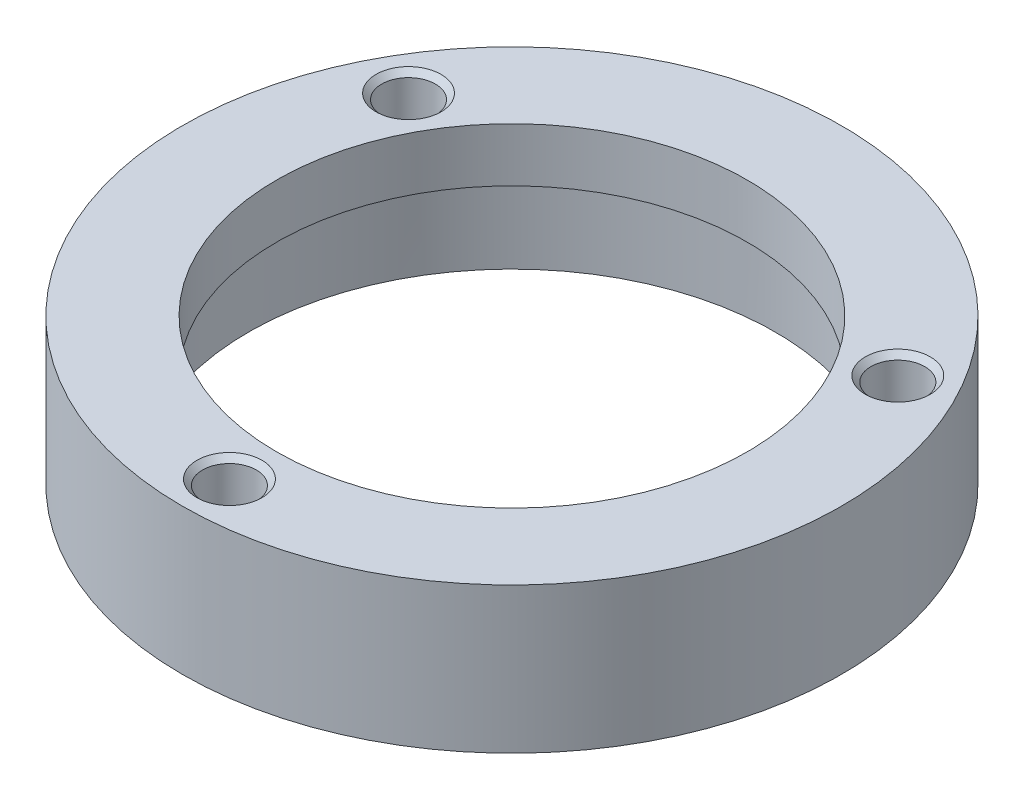
ISO-10303-21;
HEADER;
FILE_DESCRIPTION(('STEP AP214'),'2;1');
FILE_NAME('part.step','',(''),(''),'','','');
FILE_SCHEMA(('AUTOMOTIVE_DESIGN { 1 0 10303 214 1 1 1 1 }'));
ENDSEC;
DATA;
#1=APPLICATION_CONTEXT('core data for automotive mechanical design processes');
#2=APPLICATION_PROTOCOL_DEFINITION('international standard','automotive_design',2000,#1);
#3=PRODUCT_CONTEXT('',#1,'mechanical');
#4=PRODUCT('Part','Part','',(#3));
#5=PRODUCT_RELATED_PRODUCT_CATEGORY('part','',(#4));
#6=PRODUCT_DEFINITION_FORMATION('','',#4);
#7=PRODUCT_DEFINITION_CONTEXT('part definition',#1,'design');
#8=PRODUCT_DEFINITION('design','',#6,#7);
#9=PRODUCT_DEFINITION_SHAPE('','',#8);
#10=(LENGTH_UNIT() NAMED_UNIT(*) SI_UNIT(.MILLI.,.METRE.));
#11=(NAMED_UNIT(*) PLANE_ANGLE_UNIT() SI_UNIT($,.RADIAN.));
#12=(NAMED_UNIT(*) SI_UNIT($,.STERADIAN.) SOLID_ANGLE_UNIT());
#13=UNCERTAINTY_MEASURE_WITH_UNIT(LENGTH_MEASURE(1.E-05),#10,'distance_accuracy_value','');
#14=(GEOMETRIC_REPRESENTATION_CONTEXT(3) GLOBAL_UNCERTAINTY_ASSIGNED_CONTEXT((#13)) GLOBAL_UNIT_ASSIGNED_CONTEXT((#10,
#11,#12)) REPRESENTATION_CONTEXT('',''));
#15=CARTESIAN_POINT('',(0.,0.,0.));
#16=DIRECTION('',(0.,0.,1.));
#17=DIRECTION('',(1.,0.,0.));
#18=AXIS2_PLACEMENT_3D('',#15,#16,#17);
#19=CARTESIAN_POINT('',(0.,13.,0.));
#20=DIRECTION('',(0.,1.,0.));
#21=DIRECTION('',(0.,0.,-1.));
#22=AXIS2_PLACEMENT_3D('',#19,#20,#21);
#23=PLANE('',#22);
#24=CARTESIAN_POINT('',(-21.8238401753679,13.,-12.6));
#25=DIRECTION('',(0.,-1.,0.));
#26=DIRECTION('',(0.,0.,-1.));
#27=AXIS2_PLACEMENT_3D('',#24,#25,#26);
#28=CIRCLE('',#27,2.90000000000001);
#29=CARTESIAN_POINT('',(-21.8238401753679,13.,-15.5));
#30=VERTEX_POINT('',#29);
#31=EDGE_CURVE('E55',#30,#30,#28,.F.);
#32=ORIENTED_EDGE('',*,*,#31,.F.);
#33=EDGE_LOOP('',(#32));
#34=FACE_BOUND('',#33,.T.);
#35=CARTESIAN_POINT('',(21.8238401753679,13.,-12.6));
#36=DIRECTION('',(0.,-1.,0.));
#37=DIRECTION('',(0.,0.,-1.));
#38=AXIS2_PLACEMENT_3D('',#35,#36,#37);
#39=CIRCLE('',#38,2.90000000000012);
#40=CARTESIAN_POINT('',(21.8238401753679,13.,-15.5000000000001));
#41=VERTEX_POINT('',#40);
#42=EDGE_CURVE('E60',#41,#41,#39,.F.);
#43=ORIENTED_EDGE('',*,*,#42,.F.);
#44=EDGE_LOOP('',(#43));
#45=FACE_BOUND('',#44,.T.);
#46=CARTESIAN_POINT('',(0.,13.,25.2));
#47=DIRECTION('',(0.,-1.,0.));
#48=DIRECTION('',(0.,0.,-1.));
#49=AXIS2_PLACEMENT_3D('',#46,#47,#48);
#50=CIRCLE('',#49,2.90000000000001);
#51=CARTESIAN_POINT('',(0.,13.,22.3));
#52=VERTEX_POINT('',#51);
#53=EDGE_CURVE('E63',#52,#52,#50,.F.);
#54=ORIENTED_EDGE('',*,*,#53,.F.);
#55=EDGE_LOOP('',(#54));
#56=FACE_BOUND('',#55,.T.);
#57=CARTESIAN_POINT('',(0.,13.,0.));
#58=DIRECTION('',(0.,-1.,0.));
#59=DIRECTION('',(0.,0.,-1.));
#60=AXIS2_PLACEMENT_3D('',#57,#58,#59);
#61=CIRCLE('',#60,29.4);
#62=CARTESIAN_POINT('',(0.,13.,29.4));
#63=VERTEX_POINT('',#62);
#64=EDGE_CURVE('E69',#63,#63,#61,.T.);
#65=ORIENTED_EDGE('',*,*,#64,.F.);
#66=EDGE_LOOP('',(#65));
#67=FACE_BOUND('',#66,.T.);
#68=CARTESIAN_POINT('',(0.,13.,0.));
#69=DIRECTION('',(0.,-1.,0.));
#70=DIRECTION('',(0.,0.,-1.));
#71=AXIS2_PLACEMENT_3D('',#68,#69,#70);
#72=CIRCLE('',#71,21.);
#73=CARTESIAN_POINT('',(0.,13.,21.));
#74=VERTEX_POINT('',#73);
#75=EDGE_CURVE('E73',#74,#74,#72,.T.);
#76=ORIENTED_EDGE('',*,*,#75,.T.);
#77=EDGE_LOOP('',(#76));
#78=FACE_BOUND('',#77,.T.);
#79=ADVANCED_FACE('F43',(#34,#45,#56,#67,#78),#23,.T.);
#80=CARTESIAN_POINT('',(0.,0.,0.));
#81=DIRECTION('',(0.,1.,0.));
#82=DIRECTION('',(0.,0.,-1.));
#83=AXIS2_PLACEMENT_3D('',#80,#81,#82);
#84=PLANE('',#83);
#85=CARTESIAN_POINT('',(0.,0.,0.));
#86=DIRECTION('',(0.,1.,0.));
#87=DIRECTION('',(0.,0.,1.));
#88=AXIS2_PLACEMENT_3D('',#85,#86,#87);
#89=CIRCLE('',#88,23.5);
#90=CARTESIAN_POINT('',(0.,0.,23.5));
#91=VERTEX_POINT('',#90);
#92=EDGE_CURVE('E90',#91,#91,#89,.T.);
#93=ORIENTED_EDGE('',*,*,#92,.T.);
#94=EDGE_LOOP('',(#93));
#95=FACE_BOUND('',#94,.T.);
#96=CARTESIAN_POINT('',(0.,0.,0.));
#97=DIRECTION('',(0.,-1.,0.));
#98=DIRECTION('',(0.,0.,-1.));
#99=AXIS2_PLACEMENT_3D('',#96,#97,#98);
#100=CIRCLE('',#99,29.4);
#101=CARTESIAN_POINT('',(0.,0.,29.4));
#102=VERTEX_POINT('',#101);
#103=EDGE_CURVE('E70',#102,#102,#100,.T.);
#104=ORIENTED_EDGE('',*,*,#103,.T.);
#105=EDGE_LOOP('',(#104));
#106=FACE_BOUND('',#105,.T.);
#107=ADVANCED_FACE('F94',(#95,#106),#84,.F.);
#108=CARTESIAN_POINT('',(0.,13.,0.));
#109=DIRECTION('',(0.,-1.,0.));
#110=DIRECTION('',(0.,0.,1.));
#111=AXIS2_PLACEMENT_3D('',#108,#109,#110);
#112=CYLINDRICAL_SURFACE('',#111,29.4);
#113=CARTESIAN_POINT('',(0.,13.,29.4));
#114=CARTESIAN_POINT('',(0.,12.8645833333333,29.4));
#115=CARTESIAN_POINT('',(0.,12.7291666666667,29.4));
#116=CARTESIAN_POINT('',(0.,12.4583333333333,29.4));
#117=CARTESIAN_POINT('',(0.,12.3229166666667,29.4));
#118=CARTESIAN_POINT('',(0.,12.0520833333333,29.4));
#119=CARTESIAN_POINT('',(0.,11.9166666666667,29.4));
#120=CARTESIAN_POINT('',(0.,11.6458333333333,29.4));
#121=CARTESIAN_POINT('',(0.,11.5104166666667,29.4));
#122=CARTESIAN_POINT('',(0.,11.2395833333333,29.4));
#123=CARTESIAN_POINT('',(0.,11.1041666666667,29.4));
#124=CARTESIAN_POINT('',(0.,10.8333333333333,29.4));
#125=CARTESIAN_POINT('',(0.,10.6979166666667,29.4));
#126=CARTESIAN_POINT('',(0.,10.4270833333333,29.4));
#127=CARTESIAN_POINT('',(0.,10.2916666666667,29.4));
#128=CARTESIAN_POINT('',(0.,10.0208333333333,29.4));
#129=CARTESIAN_POINT('',(0.,9.88541666666667,29.4));
#130=CARTESIAN_POINT('',(0.,9.61458333333333,29.4));
#131=CARTESIAN_POINT('',(0.,9.47916666666667,29.4));
#132=CARTESIAN_POINT('',(0.,9.20833333333333,29.4));
#133=CARTESIAN_POINT('',(0.,9.07291666666667,29.4));
#134=CARTESIAN_POINT('',(0.,8.80208333333333,29.4));
#135=CARTESIAN_POINT('',(0.,8.66666666666667,29.4));
#136=CARTESIAN_POINT('',(0.,8.39583333333333,29.4));
#137=CARTESIAN_POINT('',(0.,8.26041666666667,29.4));
#138=CARTESIAN_POINT('',(0.,7.98958333333333,29.4));
#139=CARTESIAN_POINT('',(0.,7.85416666666667,29.4));
#140=CARTESIAN_POINT('',(0.,7.58333333333333,29.4));
#141=CARTESIAN_POINT('',(0.,7.44791666666667,29.4));
#142=CARTESIAN_POINT('',(0.,7.17708333333333,29.4));
#143=CARTESIAN_POINT('',(0.,7.04166666666667,29.4));
#144=CARTESIAN_POINT('',(0.,6.77083333333333,29.4));
#145=CARTESIAN_POINT('',(0.,6.63541666666667,29.4));
#146=CARTESIAN_POINT('',(0.,6.36458333333333,29.4));
#147=CARTESIAN_POINT('',(0.,6.22916666666667,29.4));
#148=CARTESIAN_POINT('',(0.,5.95833333333333,29.4));
#149=CARTESIAN_POINT('',(0.,5.82291666666667,29.4));
#150=CARTESIAN_POINT('',(0.,5.55208333333333,29.4));
#151=CARTESIAN_POINT('',(0.,5.41666666666667,29.4));
#152=CARTESIAN_POINT('',(0.,5.14583333333333,29.4));
#153=CARTESIAN_POINT('',(0.,5.01041666666667,29.4));
#154=CARTESIAN_POINT('',(0.,4.73958333333333,29.4));
#155=CARTESIAN_POINT('',(0.,4.60416666666667,29.4));
#156=CARTESIAN_POINT('',(0.,4.33333333333333,29.4));
#157=CARTESIAN_POINT('',(0.,4.19791666666667,29.4));
#158=CARTESIAN_POINT('',(0.,3.92708333333333,29.4));
#159=CARTESIAN_POINT('',(0.,3.79166666666667,29.4));
#160=CARTESIAN_POINT('',(0.,3.52083333333333,29.4));
#161=CARTESIAN_POINT('',(0.,3.38541666666667,29.4));
#162=CARTESIAN_POINT('',(0.,3.11458333333333,29.4));
#163=CARTESIAN_POINT('',(0.,2.97916666666667,29.4));
#164=CARTESIAN_POINT('',(0.,2.70833333333333,29.4));
#165=CARTESIAN_POINT('',(0.,2.57291666666667,29.4));
#166=CARTESIAN_POINT('',(0.,2.30208333333333,29.4));
#167=CARTESIAN_POINT('',(0.,2.16666666666667,29.4));
#168=CARTESIAN_POINT('',(0.,1.89583333333333,29.4));
#169=CARTESIAN_POINT('',(0.,1.76041666666667,29.4));
#170=CARTESIAN_POINT('',(0.,1.48958333333333,29.4));
#171=CARTESIAN_POINT('',(0.,1.35416666666667,29.4));
#172=CARTESIAN_POINT('',(0.,1.08333333333333,29.4));
#173=CARTESIAN_POINT('',(0.,0.947916666666667,29.4));
#174=CARTESIAN_POINT('',(0.,0.677083333333334,29.4));
#175=CARTESIAN_POINT('',(0.,0.541666666666667,29.4));
#176=CARTESIAN_POINT('',(0.,0.270833333333334,29.4));
#177=CARTESIAN_POINT('',(0.,0.135416666666667,29.4));
#178=CARTESIAN_POINT('',(0.,0.,29.4));
#179=B_SPLINE_CURVE_WITH_KNOTS('',3,(#113,#114,#115,#116,#117,#118,#119,#120,#121,#122,#123,
#124,#125,#126,#127,#128,#129,#130,#131,#132,#133,#134,#135,#136,#137,#138,#139,#140,#141,#142,
#143,#144,#145,#146,#147,#148,#149,#150,#151,#152,#153,#154,#155,#156,#157,#158,#159,#160,#161,
#162,#163,#164,#165,#166,#167,#168,#169,#170,#171,#172,#173,#174,#175,#176,#177,#178),
.UNSPECIFIED.,.F.,.F.,(4,2,2,2,2,2,2,2,2,2,2,2,2,2,2,2,2,2,2,2,2,2,2,2,2,2,2,2,2,2,2,2,4),(0.,
0.40625,0.812500000000001,1.21875,1.625,2.03125,2.4375,2.84375,3.25,3.65625,4.0625,4.46875,
4.875,5.28125,5.6875,6.09375,6.5,6.90625,7.3125,7.71875,8.125,8.53125,8.9375,9.34375,9.75,
10.15625,10.5625,10.96875,11.375,11.78125,12.1875,12.59375,13.),.UNSPECIFIED.);
#180=EDGE_CURVE('BSEAM120',#63,#102,#179,.T.);
#181=ORIENTED_EDGE('',*,*,#64,.T.);
#182=ORIENTED_EDGE('',*,*,#103,.F.);
#183=ORIENTED_EDGE('',*,*,#180,.T.);
#184=ORIENTED_EDGE('',*,*,#180,.F.);
#185=EDGE_LOOP('',(#181,#183,#182,#184));
#186=FACE_BOUND('',#185,.T.);
#187=ADVANCED_FACE('F120',(#186),#112,.T.);
#188=CARTESIAN_POINT('',(0.,13.,0.));
#189=DIRECTION('',(0.,-1.,0.));
#190=DIRECTION('',(0.,0.,1.));
#191=AXIS2_PLACEMENT_3D('',#188,#189,#190);
#192=CYLINDRICAL_SURFACE('',#191,21.);
#193=CARTESIAN_POINT('',(0.,8.2,0.));
#194=DIRECTION('',(0.,-1.,0.));
#195=DIRECTION('',(0.,0.,-1.));
#196=AXIS2_PLACEMENT_3D('',#193,#194,#195);
#197=CIRCLE('',#196,21.);
#198=CARTESIAN_POINT('',(0.,8.2,21.));
#199=VERTEX_POINT('',#198);
#200=EDGE_CURVE('E47',#199,#199,#197,.T.);
#201=CARTESIAN_POINT('',(0.,8.2,21.));
#202=CARTESIAN_POINT('',(0.,8.25,21.));
#203=CARTESIAN_POINT('',(0.,8.3,21.));
#204=CARTESIAN_POINT('',(0.,8.4,21.));
#205=CARTESIAN_POINT('',(0.,8.45,21.));
#206=CARTESIAN_POINT('',(0.,8.55,21.));
#207=CARTESIAN_POINT('',(0.,8.6,21.));
#208=CARTESIAN_POINT('',(0.,8.7,21.));
#209=CARTESIAN_POINT('',(0.,8.75,21.));
#210=CARTESIAN_POINT('',(0.,8.85,21.));
#211=CARTESIAN_POINT('',(0.,8.9,21.));
#212=CARTESIAN_POINT('',(0.,9.,21.));
#213=CARTESIAN_POINT('',(0.,9.05,21.));
#214=CARTESIAN_POINT('',(0.,9.15,21.));
#215=CARTESIAN_POINT('',(0.,9.2,21.));
#216=CARTESIAN_POINT('',(0.,9.3,21.));
#217=CARTESIAN_POINT('',(0.,9.35,21.));
#218=CARTESIAN_POINT('',(0.,9.45,21.));
#219=CARTESIAN_POINT('',(0.,9.5,21.));
#220=CARTESIAN_POINT('',(0.,9.6,21.));
#221=CARTESIAN_POINT('',(0.,9.65,21.));
#222=CARTESIAN_POINT('',(0.,9.75,21.));
#223=CARTESIAN_POINT('',(0.,9.8,21.));
#224=CARTESIAN_POINT('',(0.,9.9,21.));
#225=CARTESIAN_POINT('',(0.,9.95,21.));
#226=CARTESIAN_POINT('',(0.,10.05,21.));
#227=CARTESIAN_POINT('',(0.,10.1,21.));
#228=CARTESIAN_POINT('',(0.,10.2,21.));
#229=CARTESIAN_POINT('',(0.,10.25,21.));
#230=CARTESIAN_POINT('',(0.,10.35,21.));
#231=CARTESIAN_POINT('',(0.,10.4,21.));
#232=CARTESIAN_POINT('',(0.,10.5,21.));
#233=CARTESIAN_POINT('',(0.,10.55,21.));
#234=CARTESIAN_POINT('',(0.,10.65,21.));
#235=CARTESIAN_POINT('',(0.,10.7,21.));
#236=CARTESIAN_POINT('',(0.,10.8,21.));
#237=CARTESIAN_POINT('',(0.,10.85,21.));
#238=CARTESIAN_POINT('',(0.,10.95,21.));
#239=CARTESIAN_POINT('',(0.,11.,21.));
#240=CARTESIAN_POINT('',(0.,11.1,21.));
#241=CARTESIAN_POINT('',(0.,11.15,21.));
#242=CARTESIAN_POINT('',(0.,11.25,21.));
#243=CARTESIAN_POINT('',(0.,11.3,21.));
#244=CARTESIAN_POINT('',(0.,11.4,21.));
#245=CARTESIAN_POINT('',(0.,11.45,21.));
#246=CARTESIAN_POINT('',(0.,11.55,21.));
#247=CARTESIAN_POINT('',(0.,11.6,21.));
#248=CARTESIAN_POINT('',(0.,11.7,21.));
#249=CARTESIAN_POINT('',(0.,11.75,21.));
#250=CARTESIAN_POINT('',(0.,11.85,21.));
#251=CARTESIAN_POINT('',(0.,11.9,21.));
#252=CARTESIAN_POINT('',(0.,12.,21.));
#253=CARTESIAN_POINT('',(0.,12.05,21.));
#254=CARTESIAN_POINT('',(0.,12.15,21.));
#255=CARTESIAN_POINT('',(0.,12.2,21.));
#256=CARTESIAN_POINT('',(0.,12.3,21.));
#257=CARTESIAN_POINT('',(0.,12.35,21.));
#258=CARTESIAN_POINT('',(0.,12.45,21.));
#259=CARTESIAN_POINT('',(0.,12.5,21.));
#260=CARTESIAN_POINT('',(0.,12.6,21.));
#261=CARTESIAN_POINT('',(0.,12.65,21.));
#262=CARTESIAN_POINT('',(0.,12.75,21.));
#263=CARTESIAN_POINT('',(0.,12.8,21.));
#264=CARTESIAN_POINT('',(0.,12.9,21.));
#265=CARTESIAN_POINT('',(0.,12.95,21.));
#266=CARTESIAN_POINT('',(0.,13.,21.));
#267=B_SPLINE_CURVE_WITH_KNOTS('',3,(#201,#202,#203,#204,#205,#206,#207,#208,#209,#210,#211,
#212,#213,#214,#215,#216,#217,#218,#219,#220,#221,#222,#223,#224,#225,#226,#227,#228,#229,#230,
#231,#232,#233,#234,#235,#236,#237,#238,#239,#240,#241,#242,#243,#244,#245,#246,#247,#248,#249,
#250,#251,#252,#253,#254,#255,#256,#257,#258,#259,#260,#261,#262,#263,#264,#265,#266),
.UNSPECIFIED.,.F.,.F.,(4,2,2,2,2,2,2,2,2,2,2,2,2,2,2,2,2,2,2,2,2,2,2,2,2,2,2,2,2,2,2,2,4),(0.,
0.150000000000001,0.300000000000002,0.450000000000001,0.6,0.750000000000001,0.900000000000001,
1.05,1.2,1.35,1.5,1.65,1.8,1.95,2.1,2.25,2.4,2.55,2.7,2.85,3.,3.15,3.3,3.45,3.6,3.75,3.9,4.05,
4.2,4.35,4.5,4.65,4.8),.UNSPECIFIED.);
#268=EDGE_CURVE('BSEAM125',#199,#74,#267,.T.);
#269=ORIENTED_EDGE('',*,*,#200,.T.);
#270=ORIENTED_EDGE('',*,*,#75,.F.);
#271=ORIENTED_EDGE('',*,*,#268,.T.);
#272=ORIENTED_EDGE('',*,*,#268,.F.);
#273=EDGE_LOOP('',(#269,#271,#270,#272));
#274=FACE_BOUND('',#273,.T.);
#275=ADVANCED_FACE('F125',(#274),#192,.F.);
#276=CARTESIAN_POINT('',(-21.8238401753679,9.,-12.6));
#277=DIRECTION('',(0.,1.,0.));
#278=DIRECTION('',(0.,0.,-1.));
#279=AXIS2_PLACEMENT_3D('',#276,#277,#278);
#280=CYLINDRICAL_SURFACE('',#279,2.4);
#281=CARTESIAN_POINT('',(-21.8238401753679,12.5,-12.6));
#282=DIRECTION('',(0.,-1.,0.));
#283=DIRECTION('',(0.,0.,-1.));
#284=AXIS2_PLACEMENT_3D('',#281,#282,#283);
#285=CIRCLE('',#284,2.4);
#286=CARTESIAN_POINT('',(-21.8238401753679,12.5,-15.));
#287=VERTEX_POINT('',#286);
#288=EDGE_CURVE('E66',#287,#287,#285,.T.);
#289=ORIENTED_EDGE('',*,*,#288,.F.);
#290=EDGE_LOOP('',(#289));
#291=FACE_BOUND('',#290,.T.);
#292=CARTESIAN_POINT('',(-21.8238401753679,9.,-12.6));
#293=DIRECTION('',(0.,-1.,0.));
#294=DIRECTION('',(0.,0.,-1.));
#295=AXIS2_PLACEMENT_3D('',#292,#293,#294);
#296=CIRCLE('',#295,2.4);
#297=CARTESIAN_POINT('',(-21.8238401753679,9.,-15.));
#298=VERTEX_POINT('',#297);
#299=EDGE_CURVE('E79',#298,#298,#296,.T.);
#300=ORIENTED_EDGE('',*,*,#299,.T.);
#301=EDGE_LOOP('',(#300));
#302=FACE_BOUND('',#301,.T.);
#303=ADVANCED_FACE('F160',(#291,#302),#280,.F.);
#304=CARTESIAN_POINT('',(-21.8238401753679,9.,-12.6));
#305=DIRECTION('',(0.,1.,0.));
#306=DIRECTION('',(0.,0.,-1.));
#307=AXIS2_PLACEMENT_3D('',#304,#305,#306);
#308=PLANE('',#307);
#309=ORIENTED_EDGE('',*,*,#299,.F.);
#310=EDGE_LOOP('',(#309));
#311=FACE_BOUND('',#310,.T.);
#312=ADVANCED_FACE('F147',(#311),#308,.T.);
#313=CARTESIAN_POINT('',(21.8238401753679,9.,-12.6));
#314=DIRECTION('',(0.,1.,0.));
#315=DIRECTION('',(0.,0.,-1.));
#316=AXIS2_PLACEMENT_3D('',#313,#314,#315);
#317=CYLINDRICAL_SURFACE('',#316,2.40000000000012);
#318=CARTESIAN_POINT('',(21.8238401753679,12.5,-12.6));
#319=DIRECTION('',(0.,-1.,0.));
#320=DIRECTION('',(0.,0.,-1.));
#321=AXIS2_PLACEMENT_3D('',#318,#319,#320);
#322=CIRCLE('',#321,2.40000000000012);
#323=CARTESIAN_POINT('',(21.8238401753679,12.5,-15.0000000000001));
#324=VERTEX_POINT('',#323);
#325=EDGE_CURVE('E51',#324,#324,#322,.T.);
#326=ORIENTED_EDGE('',*,*,#325,.F.);
#327=EDGE_LOOP('',(#326));
#328=FACE_BOUND('',#327,.T.);
#329=CARTESIAN_POINT('',(21.8238401753679,9.,-12.6));
#330=DIRECTION('',(0.,-1.,0.));
#331=DIRECTION('',(0.,0.,-1.));
#332=AXIS2_PLACEMENT_3D('',#329,#330,#331);
#333=CIRCLE('',#332,2.40000000000012);
#334=CARTESIAN_POINT('',(21.8238401753679,9.,-15.0000000000001));
#335=VERTEX_POINT('',#334);
#336=EDGE_CURVE('E82',#335,#335,#333,.T.);
#337=ORIENTED_EDGE('',*,*,#336,.T.);
#338=EDGE_LOOP('',(#337));
#339=FACE_BOUND('',#338,.T.);
#340=ADVANCED_FACE('F143',(#328,#339),#317,.F.);
#341=CARTESIAN_POINT('',(21.8238401753679,9.,-12.6));
#342=DIRECTION('',(0.,1.,0.));
#343=DIRECTION('',(0.,0.,-1.));
#344=AXIS2_PLACEMENT_3D('',#341,#342,#343);
#345=PLANE('',#344);
#346=ORIENTED_EDGE('',*,*,#336,.F.);
#347=EDGE_LOOP('',(#346));
#348=FACE_BOUND('',#347,.T.);
#349=ADVANCED_FACE('F146',(#348),#345,.T.);
#350=CARTESIAN_POINT('',(0.,9.,25.2));
#351=DIRECTION('',(0.,1.,0.));
#352=DIRECTION('',(0.,0.,-1.));
#353=AXIS2_PLACEMENT_3D('',#350,#351,#352);
#354=CYLINDRICAL_SURFACE('',#353,2.4);
#355=CARTESIAN_POINT('',(0.,12.5,25.2));
#356=DIRECTION('',(0.,-1.,0.));
#357=DIRECTION('',(0.,0.,-1.));
#358=AXIS2_PLACEMENT_3D('',#355,#356,#357);
#359=CIRCLE('',#358,2.4);
#360=CARTESIAN_POINT('',(0.,12.5,22.8));
#361=VERTEX_POINT('',#360);
#362=EDGE_CURVE('E11',#361,#361,#359,.T.);
#363=ORIENTED_EDGE('',*,*,#362,.F.);
#364=EDGE_LOOP('',(#363));
#365=FACE_BOUND('',#364,.T.);
#366=CARTESIAN_POINT('',(0.,9.,25.2));
#367=DIRECTION('',(0.,-1.,0.));
#368=DIRECTION('',(0.,0.,-1.));
#369=AXIS2_PLACEMENT_3D('',#366,#367,#368);
#370=CIRCLE('',#369,2.4);
#371=CARTESIAN_POINT('',(0.,9.,22.8));
#372=VERTEX_POINT('',#371);
#373=EDGE_CURVE('E78',#372,#372,#370,.T.);
#374=ORIENTED_EDGE('',*,*,#373,.T.);
#375=EDGE_LOOP('',(#374));
#376=FACE_BOUND('',#375,.T.);
#377=ADVANCED_FACE('F152',(#365,#376),#354,.F.);
#378=CARTESIAN_POINT('',(0.,9.,25.2));
#379=DIRECTION('',(0.,1.,0.));
#380=DIRECTION('',(0.,0.,-1.));
#381=AXIS2_PLACEMENT_3D('',#378,#379,#380);
#382=PLANE('',#381);
#383=ORIENTED_EDGE('',*,*,#373,.F.);
#384=EDGE_LOOP('',(#383));
#385=FACE_BOUND('',#384,.T.);
#386=ADVANCED_FACE('F133',(#385),#382,.T.);
#387=CARTESIAN_POINT('',(-21.8238401753679,12.5,-12.6));
#388=DIRECTION('',(0.,1.,0.));
#389=DIRECTION('',(0.,0.,-1.));
#390=AXIS2_PLACEMENT_3D('',#387,#388,#389);
#391=CONICAL_SURFACE('',#390,2.4,0.785398163397447);
#392=ORIENTED_EDGE('',*,*,#31,.T.);
#393=EDGE_LOOP('',(#392));
#394=FACE_BOUND('',#393,.T.);
#395=ORIENTED_EDGE('',*,*,#288,.T.);
#396=EDGE_LOOP('',(#395));
#397=FACE_BOUND('',#396,.T.);
#398=ADVANCED_FACE('F131',(#394,#397),#391,.F.);
#399=CARTESIAN_POINT('',(21.8238401753679,12.5,-12.6));
#400=DIRECTION('',(0.,1.,0.));
#401=DIRECTION('',(0.,0.,-1.));
#402=AXIS2_PLACEMENT_3D('',#399,#400,#401);
#403=CONICAL_SURFACE('',#402,2.40000000000012,0.785398163397447);
#404=ORIENTED_EDGE('',*,*,#42,.T.);
#405=EDGE_LOOP('',(#404));
#406=FACE_BOUND('',#405,.T.);
#407=ORIENTED_EDGE('',*,*,#325,.T.);
#408=EDGE_LOOP('',(#407));
#409=FACE_BOUND('',#408,.T.);
#410=ADVANCED_FACE('F110',(#406,#409),#403,.F.);
#411=CARTESIAN_POINT('',(0.,12.5,25.2));
#412=DIRECTION('',(0.,1.,0.));
#413=DIRECTION('',(0.,0.,-1.));
#414=AXIS2_PLACEMENT_3D('',#411,#412,#413);
#415=CONICAL_SURFACE('',#414,2.4,0.785398163397448);
#416=ORIENTED_EDGE('',*,*,#53,.T.);
#417=EDGE_LOOP('',(#416));
#418=FACE_BOUND('',#417,.T.);
#419=ORIENTED_EDGE('',*,*,#362,.T.);
#420=EDGE_LOOP('',(#419));
#421=FACE_BOUND('',#420,.T.);
#422=ADVANCED_FACE('F45',(#418,#421),#415,.F.);
#423=CARTESIAN_POINT('',(0.,8.2,0.));
#424=DIRECTION('',(0.,1.,0.));
#425=DIRECTION('',(0.,0.,-1.));
#426=AXIS2_PLACEMENT_3D('',#423,#424,#425);
#427=PLANE('',#426);
#428=ORIENTED_EDGE('',*,*,#200,.F.);
#429=EDGE_LOOP('',(#428));
#430=FACE_BOUND('',#429,.T.);
#431=CARTESIAN_POINT('',(0.,8.2,0.));
#432=DIRECTION('',(0.,-1.,0.));
#433=DIRECTION('',(0.,0.,-1.));
#434=AXIS2_PLACEMENT_3D('',#431,#432,#433);
#435=CIRCLE('',#434,23.5);
#436=CARTESIAN_POINT('',(0.,8.2,-23.5));
#437=VERTEX_POINT('',#436);
#438=EDGE_CURVE('E87',#437,#437,#435,.F.);
#439=ORIENTED_EDGE('',*,*,#438,.F.);
#440=EDGE_LOOP('',(#439));
#441=FACE_BOUND('',#440,.T.);
#442=ADVANCED_FACE('F100',(#430,#441),#427,.F.);
#443=CARTESIAN_POINT('',(0.,79.4680374315355,0.));
#444=DIRECTION('',(0.,-1.,0.));
#445=DIRECTION('',(0.,0.,1.));
#446=AXIS2_PLACEMENT_3D('',#443,#444,#445);
#447=CYLINDRICAL_SURFACE('',#446,23.5);
#448=ORIENTED_EDGE('',*,*,#92,.F.);
#449=EDGE_LOOP('',(#448));
#450=FACE_BOUND('',#449,.T.);
#451=ORIENTED_EDGE('',*,*,#438,.T.);
#452=EDGE_LOOP('',(#451));
#453=FACE_BOUND('',#452,.T.);
#454=ADVANCED_FACE('F97',(#450,#453),#447,.F.);
#455=CLOSED_SHELL('',(#79,#107,#187,#275,#303,#312,#340,#349,#377,#386,#398,#410,#422,#442,#454));
#456=MANIFOLD_SOLID_BREP('B2',#455);
#457=ADVANCED_BREP_SHAPE_REPRESENTATION('',(#18,#456),#14);
#458=SHAPE_DEFINITION_REPRESENTATION(#9,#457);
ENDSEC;
END-ISO-10303-21;
